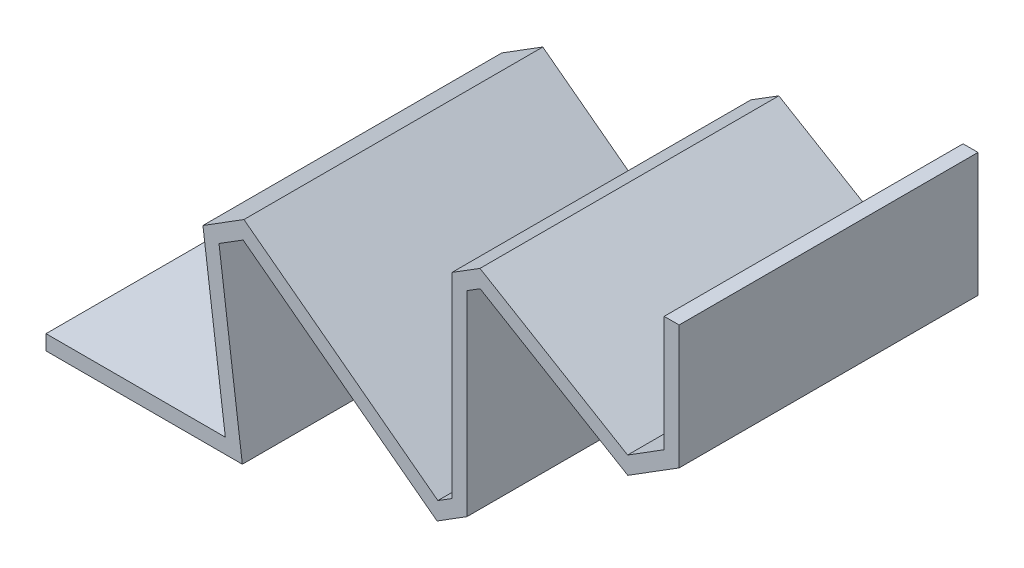
ISO-10303-21;
HEADER;
FILE_DESCRIPTION(('STEP AP214'),'2;1');
FILE_NAME('part.step','',(''),(''),'','','');
FILE_SCHEMA(('AUTOMOTIVE_DESIGN { 1 0 10303 214 1 1 1 1 }'));
ENDSEC;
DATA;
#1=APPLICATION_CONTEXT('core data for automotive mechanical design processes');
#2=APPLICATION_PROTOCOL_DEFINITION('international standard','automotive_design',2000,#1);
#3=PRODUCT_CONTEXT('',#1,'mechanical');
#4=PRODUCT('Part','Part','',(#3));
#5=PRODUCT_RELATED_PRODUCT_CATEGORY('part','',(#4));
#6=PRODUCT_DEFINITION_FORMATION('','',#4);
#7=PRODUCT_DEFINITION_CONTEXT('part definition',#1,'design');
#8=PRODUCT_DEFINITION('design','',#6,#7);
#9=PRODUCT_DEFINITION_SHAPE('','',#8);
#10=(LENGTH_UNIT() NAMED_UNIT(*) SI_UNIT(.MILLI.,.METRE.));
#11=(NAMED_UNIT(*) PLANE_ANGLE_UNIT() SI_UNIT($,.RADIAN.));
#12=(NAMED_UNIT(*) SI_UNIT($,.STERADIAN.) SOLID_ANGLE_UNIT());
#13=UNCERTAINTY_MEASURE_WITH_UNIT(LENGTH_MEASURE(1.E-05),#10,'distance_accuracy_value','');
#14=(GEOMETRIC_REPRESENTATION_CONTEXT(3) GLOBAL_UNCERTAINTY_ASSIGNED_CONTEXT((#13)) GLOBAL_UNIT_ASSIGNED_CONTEXT((#10,
#11,#12)) REPRESENTATION_CONTEXT('',''));
#15=CARTESIAN_POINT('',(0.,0.,0.));
#16=DIRECTION('',(0.,0.,1.));
#17=DIRECTION('',(1.,0.,0.));
#18=AXIS2_PLACEMENT_3D('',#15,#16,#17);
#19=CARTESIAN_POINT('',(3.28461007313167,0.,2.5));
#20=DIRECTION('',(0.,1.,0.));
#21=DIRECTION('',(-1.,0.,0.));
#22=AXIS2_PLACEMENT_3D('',#19,#20,#21);
#23=PLANE('',#22);
#24=DIRECTION('',(1.,0.,0.));
#25=VECTOR('',#24,1.);
#26=CARTESIAN_POINT('',(3.28461007313167,0.,-2.5));
#27=LINE('',#26,#25);
#28=CARTESIAN_POINT('',(0.,0.,-2.5));
#29=VERTEX_POINT('',#28);
#30=CARTESIAN_POINT('',(3.28461007313167,0.,-2.5));
#31=VERTEX_POINT('',#30);
#32=EDGE_CURVE('E134',#29,#31,#27,.T.);
#33=ORIENTED_EDGE('',*,*,#32,.T.);
#34=DIRECTION('',(0.,0.,-1.));
#35=VECTOR('',#34,1.);
#36=CARTESIAN_POINT('',(3.28461007313167,0.,2.5));
#37=LINE('',#36,#35);
#38=CARTESIAN_POINT('',(3.28461007313167,0.,2.5));
#39=VERTEX_POINT('',#38);
#40=EDGE_CURVE('E11',#39,#31,#37,.T.);
#41=ORIENTED_EDGE('',*,*,#40,.F.);
#42=DIRECTION('',(1.,0.,0.));
#43=VECTOR('',#42,1.);
#44=CARTESIAN_POINT('',(0.,0.,2.5));
#45=LINE('',#44,#43);
#46=CARTESIAN_POINT('',(0.,0.,2.5));
#47=VERTEX_POINT('',#46);
#48=EDGE_CURVE('E140',#47,#39,#45,.T.);
#49=ORIENTED_EDGE('',*,*,#48,.F.);
#50=DIRECTION('',(0.,0.,-1.));
#51=VECTOR('',#50,1.);
#52=CARTESIAN_POINT('',(0.,0.,2.5));
#53=LINE('',#52,#51);
#54=EDGE_CURVE('E220',#47,#29,#53,.T.);
#55=ORIENTED_EDGE('',*,*,#54,.T.);
#56=EDGE_LOOP('',(#33,#41,#49,#55));
#57=FACE_BOUND('',#56,.T.);
#58=ADVANCED_FACE('F39',(#57),#23,.F.);
#59=CARTESIAN_POINT('',(2.89412978055959,3.00316875454847,2.5));
#60=DIRECTION('',(-0.991652731655363,-0.128937425910623,0.));
#61=DIRECTION('',(0.128937425910623,-0.991652731655363,0.));
#62=AXIS2_PLACEMENT_3D('',#59,#60,#61);
#63=PLANE('',#62);
#64=DIRECTION('',(-0.128937425910623,0.991652731655362,0.));
#65=VECTOR('',#64,1.);
#66=CARTESIAN_POINT('',(2.89412978055959,3.00316875454847,-2.5));
#67=LINE('',#66,#65);
#68=CARTESIAN_POINT('',(2.89412978055959,3.00316875454847,-2.5));
#69=VERTEX_POINT('',#68);
#70=EDGE_CURVE('E226',#31,#69,#67,.T.);
#71=ORIENTED_EDGE('',*,*,#70,.T.);
#72=DIRECTION('',(0.,0.,-1.));
#73=VECTOR('',#72,1.);
#74=CARTESIAN_POINT('',(2.89412978055959,3.00316875454847,2.5));
#75=LINE('',#74,#73);
#76=CARTESIAN_POINT('',(2.89412978055959,3.00316875454847,2.5));
#77=VERTEX_POINT('',#76);
#78=EDGE_CURVE('E48',#77,#69,#75,.T.);
#79=ORIENTED_EDGE('',*,*,#78,.F.);
#80=DIRECTION('',(-0.128937425910623,0.991652731655362,0.));
#81=VECTOR('',#80,1.);
#82=CARTESIAN_POINT('',(2.89412978055959,3.00316875454847,2.5));
#83=LINE('',#82,#81);
#84=EDGE_CURVE('E442',#39,#77,#83,.T.);
#85=ORIENTED_EDGE('',*,*,#84,.F.);
#86=ORIENTED_EDGE('',*,*,#40,.T.);
#87=EDGE_LOOP('',(#71,#79,#85,#86));
#88=FACE_BOUND('',#87,.T.);
#89=ADVANCED_FACE('F447',(#88),#63,.F.);
#90=CARTESIAN_POINT('',(3.29779881563138,3.25541773696787,2.5));
#91=DIRECTION('',(-0.529932218646367,0.848040001203091,0.));
#92=DIRECTION('',(-0.848040001203091,-0.529932218646367,0.));
#93=AXIS2_PLACEMENT_3D('',#90,#91,#92);
#94=PLANE('',#93);
#95=DIRECTION('',(0.848040001203091,0.529932218646367,0.));
#96=VECTOR('',#95,1.);
#97=CARTESIAN_POINT('',(3.29779881563138,3.25541773696787,-2.5));
#98=LINE('',#97,#96);
#99=CARTESIAN_POINT('',(3.29779881563138,3.25541773696787,-2.5));
#100=VERTEX_POINT('',#99);
#101=EDGE_CURVE('E229',#69,#100,#98,.T.);
#102=ORIENTED_EDGE('',*,*,#101,.T.);
#103=DIRECTION('',(0.,0.,-1.));
#104=VECTOR('',#103,1.);
#105=CARTESIAN_POINT('',(3.29779881563138,3.25541773696787,2.5));
#106=LINE('',#105,#104);
#107=CARTESIAN_POINT('',(3.29779881563138,3.25541773696787,2.5));
#108=VERTEX_POINT('',#107);
#109=EDGE_CURVE('E354',#108,#100,#106,.T.);
#110=ORIENTED_EDGE('',*,*,#109,.F.);
#111=DIRECTION('',(0.848040001203091,0.529932218646367,0.));
#112=VECTOR('',#111,1.);
#113=CARTESIAN_POINT('',(3.29779881563138,3.25541773696787,2.5));
#114=LINE('',#113,#112);
#115=EDGE_CURVE('E365',#77,#108,#114,.T.);
#116=ORIENTED_EDGE('',*,*,#115,.F.);
#117=ORIENTED_EDGE('',*,*,#78,.T.);
#118=EDGE_LOOP('',(#102,#110,#116,#117));
#119=FACE_BOUND('',#118,.T.);
#120=ADVANCED_FACE('F363',(#119),#94,.F.);
#121=CARTESIAN_POINT('',(6.54225209286056,0.806747464691319,2.5));
#122=DIRECTION('',(0.602411026461014,0.798186040468128,0.));
#123=DIRECTION('',(-0.798186040468128,0.602411026461013,0.));
#124=AXIS2_PLACEMENT_3D('',#121,#122,#123);
#125=PLANE('',#124);
#126=DIRECTION('',(0.798186040468128,-0.602411026461014,0.));
#127=VECTOR('',#126,1.);
#128=CARTESIAN_POINT('',(6.54225209286056,0.806747464691319,-2.5));
#129=LINE('',#128,#127);
#130=CARTESIAN_POINT('',(6.54225209286056,0.806747464691319,-2.5));
#131=VERTEX_POINT('',#130);
#132=EDGE_CURVE('E232',#100,#131,#129,.T.);
#133=ORIENTED_EDGE('',*,*,#132,.T.);
#134=DIRECTION('',(0.,0.,-1.));
#135=VECTOR('',#134,1.);
#136=CARTESIAN_POINT('',(6.54225209286056,0.806747464691319,2.5));
#137=LINE('',#136,#135);
#138=CARTESIAN_POINT('',(6.54225209286056,0.806747464691319,2.5));
#139=VERTEX_POINT('',#138);
#140=EDGE_CURVE('E350',#139,#131,#137,.T.);
#141=ORIENTED_EDGE('',*,*,#140,.F.);
#142=DIRECTION('',(0.798186040468128,-0.602411026461014,0.));
#143=VECTOR('',#142,1.);
#144=CARTESIAN_POINT('',(6.54225209286056,0.806747464691319,2.5));
#145=LINE('',#144,#143);
#146=EDGE_CURVE('E384',#108,#139,#145,.T.);
#147=ORIENTED_EDGE('',*,*,#146,.F.);
#148=ORIENTED_EDGE('',*,*,#109,.T.);
#149=EDGE_LOOP('',(#133,#141,#147,#148));
#150=FACE_BOUND('',#149,.T.);
#151=ADVANCED_FACE('F374',(#150),#125,.F.);
#152=CARTESIAN_POINT('',(7.04216647309153,1.11913925785342,2.5));
#153=DIRECTION('',(-0.529932218646366,0.848040001203092,0.));
#154=DIRECTION('',(-0.848040001203092,-0.529932218646366,0.));
#155=AXIS2_PLACEMENT_3D('',#152,#153,#154);
#156=PLANE('',#155);
#157=DIRECTION('',(0.848040001203092,0.529932218646366,0.));
#158=VECTOR('',#157,1.);
#159=CARTESIAN_POINT('',(7.04216647309153,1.11913925785342,-2.5));
#160=LINE('',#159,#158);
#161=CARTESIAN_POINT('',(7.04216647309153,1.11913925785342,-2.5));
#162=VERTEX_POINT('',#161);
#163=EDGE_CURVE('E235',#131,#162,#160,.T.);
#164=ORIENTED_EDGE('',*,*,#163,.T.);
#165=DIRECTION('',(0.,0.,-1.));
#166=VECTOR('',#165,1.);
#167=CARTESIAN_POINT('',(7.04216647309153,1.11913925785342,2.5));
#168=LINE('',#167,#166);
#169=CARTESIAN_POINT('',(7.04216647309153,1.11913925785342,2.5));
#170=VERTEX_POINT('',#169);
#171=EDGE_CURVE('E346',#170,#162,#168,.T.);
#172=ORIENTED_EDGE('',*,*,#171,.F.);
#173=DIRECTION('',(0.848040001203092,0.529932218646366,0.));
#174=VECTOR('',#173,1.);
#175=CARTESIAN_POINT('',(7.04216647309153,1.11913925785342,2.5));
#176=LINE('',#175,#174);
#177=EDGE_CURVE('E380',#139,#170,#176,.T.);
#178=ORIENTED_EDGE('',*,*,#177,.F.);
#179=ORIENTED_EDGE('',*,*,#140,.T.);
#180=EDGE_LOOP('',(#164,#172,#178,#179));
#181=FACE_BOUND('',#180,.T.);
#182=ADVANCED_FACE('F378',(#181),#156,.F.);
#183=CARTESIAN_POINT('',(7.04216647309153,4.39465347848046,2.5));
#184=DIRECTION('',(-1.,0.,0.));
#185=DIRECTION('',(0.,0.,1.));
#186=AXIS2_PLACEMENT_3D('',#183,#184,#185);
#187=PLANE('',#186);
#188=DIRECTION('',(0.,1.,0.));
#189=VECTOR('',#188,1.);
#190=CARTESIAN_POINT('',(7.04216647309153,4.39465347848046,-2.5));
#191=LINE('',#190,#189);
#192=CARTESIAN_POINT('',(7.04216647309153,4.39465347848046,-2.5));
#193=VERTEX_POINT('',#192);
#194=EDGE_CURVE('E238',#162,#193,#191,.T.);
#195=ORIENTED_EDGE('',*,*,#194,.T.);
#196=DIRECTION('',(0.,0.,-1.));
#197=VECTOR('',#196,1.);
#198=CARTESIAN_POINT('',(7.04216647309153,4.39465347848046,2.5));
#199=LINE('',#198,#197);
#200=CARTESIAN_POINT('',(7.04216647309153,4.39465347848046,2.5));
#201=VERTEX_POINT('',#200);
#202=EDGE_CURVE('E342',#201,#193,#199,.T.);
#203=ORIENTED_EDGE('',*,*,#202,.F.);
#204=DIRECTION('',(0.,1.,0.));
#205=VECTOR('',#204,1.);
#206=CARTESIAN_POINT('',(7.04216647309153,4.39465347848046,2.5));
#207=LINE('',#206,#205);
#208=EDGE_CURVE('E383',#170,#201,#207,.T.);
#209=ORIENTED_EDGE('',*,*,#208,.F.);
#210=ORIENTED_EDGE('',*,*,#171,.T.);
#211=EDGE_LOOP('',(#195,#203,#209,#210));
#212=FACE_BOUND('',#211,.T.);
#213=ADVANCED_FACE('F459',(#212),#187,.F.);
#214=CARTESIAN_POINT('',(7.26296632864944,4.53262923099992,2.5));
#215=DIRECTION('',(-0.529932218646367,0.848040001203092,0.));
#216=DIRECTION('',(-0.848040001203092,-0.529932218646367,0.));
#217=AXIS2_PLACEMENT_3D('',#214,#215,#216);
#218=PLANE('',#217);
#219=DIRECTION('',(0.848040001203092,0.529932218646367,0.));
#220=VECTOR('',#219,1.);
#221=CARTESIAN_POINT('',(7.26296632864944,4.53262923099992,-2.5));
#222=LINE('',#221,#220);
#223=CARTESIAN_POINT('',(7.26296632864944,4.53262923099992,-2.5));
#224=VERTEX_POINT('',#223);
#225=EDGE_CURVE('E241',#193,#224,#222,.T.);
#226=ORIENTED_EDGE('',*,*,#225,.T.);
#227=DIRECTION('',(0.,0.,-1.));
#228=VECTOR('',#227,1.);
#229=CARTESIAN_POINT('',(7.26296632864944,4.53262923099992,2.5));
#230=LINE('',#229,#228);
#231=CARTESIAN_POINT('',(7.26296632864944,4.53262923099992,2.5));
#232=VERTEX_POINT('',#231);
#233=EDGE_CURVE('E338',#232,#224,#230,.T.);
#234=ORIENTED_EDGE('',*,*,#233,.F.);
#235=DIRECTION('',(0.848040001203092,0.529932218646367,0.));
#236=VECTOR('',#235,1.);
#237=CARTESIAN_POINT('',(7.26296632864944,4.53262923099992,2.5));
#238=LINE('',#237,#236);
#239=EDGE_CURVE('E388',#201,#232,#238,.T.);
#240=ORIENTED_EDGE('',*,*,#239,.F.);
#241=ORIENTED_EDGE('',*,*,#202,.T.);
#242=EDGE_LOOP('',(#226,#234,#240,#241));
#243=FACE_BOUND('',#242,.T.);
#244=ADVANCED_FACE('F462',(#243),#218,.F.);
#245=CARTESIAN_POINT('',(9.73273143623859,3.06352302945806,2.5));
#246=DIRECTION('',(0.511228925458816,0.85944457981549,0.));
#247=DIRECTION('',(-0.85944457981549,0.511228925458816,0.));
#248=AXIS2_PLACEMENT_3D('',#245,#246,#247);
#249=PLANE('',#248);
#250=DIRECTION('',(0.85944457981549,-0.511228925458816,0.));
#251=VECTOR('',#250,1.);
#252=CARTESIAN_POINT('',(9.73273143623859,3.06352302945806,-2.5));
#253=LINE('',#252,#251);
#254=CARTESIAN_POINT('',(9.73273143623859,3.06352302945806,-2.5));
#255=VERTEX_POINT('',#254);
#256=EDGE_CURVE('E244',#224,#255,#253,.T.);
#257=ORIENTED_EDGE('',*,*,#256,.T.);
#258=DIRECTION('',(0.,0.,-1.));
#259=VECTOR('',#258,1.);
#260=CARTESIAN_POINT('',(9.73273143623859,3.06352302945806,2.5));
#261=LINE('',#260,#259);
#262=CARTESIAN_POINT('',(9.73273143623859,3.06352302945806,2.5));
#263=VERTEX_POINT('',#262);
#264=EDGE_CURVE('E334',#263,#255,#261,.T.);
#265=ORIENTED_EDGE('',*,*,#264,.F.);
#266=DIRECTION('',(0.85944457981549,-0.511228925458816,0.));
#267=VECTOR('',#266,1.);
#268=CARTESIAN_POINT('',(9.73273143623859,3.06352302945806,2.5));
#269=LINE('',#268,#267);
#270=EDGE_CURVE('E395',#232,#263,#269,.T.);
#271=ORIENTED_EDGE('',*,*,#270,.F.);
#272=ORIENTED_EDGE('',*,*,#233,.T.);
#273=EDGE_LOOP('',(#257,#265,#271,#272));
#274=FACE_BOUND('',#273,.T.);
#275=ADVANCED_FACE('F466',(#274),#249,.F.);
#276=CARTESIAN_POINT('',(10.5916206589193,3.60023482453957,2.5));
#277=DIRECTION('',(-0.529932218646366,0.848040001203092,0.));
#278=DIRECTION('',(-0.848040001203092,-0.529932218646366,0.));
#279=AXIS2_PLACEMENT_3D('',#276,#277,#278);
#280=PLANE('',#279);
#281=DIRECTION('',(0.848040001203092,0.529932218646366,0.));
#282=VECTOR('',#281,1.);
#283=CARTESIAN_POINT('',(10.5916206589193,3.60023482453957,-2.5));
#284=LINE('',#283,#282);
#285=CARTESIAN_POINT('',(10.5916206589193,3.60023482453957,-2.5));
#286=VERTEX_POINT('',#285);
#287=EDGE_CURVE('E247',#255,#286,#284,.T.);
#288=ORIENTED_EDGE('',*,*,#287,.T.);
#289=DIRECTION('',(0.,0.,-1.));
#290=VECTOR('',#289,1.);
#291=CARTESIAN_POINT('',(10.5916206589193,3.60023482453957,2.5));
#292=LINE('',#291,#290);
#293=CARTESIAN_POINT('',(10.5916206589193,3.60023482453957,2.5));
#294=VERTEX_POINT('',#293);
#295=EDGE_CURVE('E330',#294,#286,#292,.T.);
#296=ORIENTED_EDGE('',*,*,#295,.F.);
#297=DIRECTION('',(0.848040001203092,0.529932218646366,0.));
#298=VECTOR('',#297,1.);
#299=CARTESIAN_POINT('',(10.5916206589193,3.60023482453957,2.5));
#300=LINE('',#299,#298);
#301=EDGE_CURVE('E398',#263,#294,#300,.T.);
#302=ORIENTED_EDGE('',*,*,#301,.F.);
#303=ORIENTED_EDGE('',*,*,#264,.T.);
#304=EDGE_LOOP('',(#288,#296,#302,#303));
#305=FACE_BOUND('',#304,.T.);
#306=ADVANCED_FACE('F470',(#305),#280,.F.);
#307=CARTESIAN_POINT('',(10.5916206589193,5.67150867052154,2.5));
#308=DIRECTION('',(-1.,0.,0.));
#309=DIRECTION('',(0.,0.,1.));
#310=AXIS2_PLACEMENT_3D('',#307,#308,#309);
#311=PLANE('',#310);
#312=DIRECTION('',(0.,1.,0.));
#313=VECTOR('',#312,1.);
#314=CARTESIAN_POINT('',(10.5916206589193,5.67150867052154,-2.5));
#315=LINE('',#314,#313);
#316=CARTESIAN_POINT('',(10.5916206589193,5.67150867052154,-2.5));
#317=VERTEX_POINT('',#316);
#318=EDGE_CURVE('E250',#286,#317,#315,.T.);
#319=ORIENTED_EDGE('',*,*,#318,.T.);
#320=DIRECTION('',(0.,0.,-1.));
#321=VECTOR('',#320,1.);
#322=CARTESIAN_POINT('',(10.5916206589193,5.67150867052154,2.5));
#323=LINE('',#322,#321);
#324=CARTESIAN_POINT('',(10.5916206589193,5.67150867052154,2.5));
#325=VERTEX_POINT('',#324);
#326=EDGE_CURVE('E326',#325,#317,#323,.T.);
#327=ORIENTED_EDGE('',*,*,#326,.F.);
#328=DIRECTION('',(0.,1.,0.));
#329=VECTOR('',#328,1.);
#330=CARTESIAN_POINT('',(10.5916206589193,5.67150867052154,2.5));
#331=LINE('',#330,#329);
#332=EDGE_CURVE('E401',#294,#325,#331,.T.);
#333=ORIENTED_EDGE('',*,*,#332,.F.);
#334=ORIENTED_EDGE('',*,*,#295,.T.);
#335=EDGE_LOOP('',(#319,#327,#333,#334));
#336=FACE_BOUND('',#335,.T.);
#337=ADVANCED_FACE('F474',(#336),#311,.F.);
#338=CARTESIAN_POINT('',(10.3416206589193,5.67150867052154,2.5));
#339=DIRECTION('',(0.,-1.,0.));
#340=DIRECTION('',(0.,0.,-1.));
#341=AXIS2_PLACEMENT_3D('',#338,#339,#340);
#342=PLANE('',#341);
#343=DIRECTION('',(-1.,0.,0.));
#344=VECTOR('',#343,1.);
#345=CARTESIAN_POINT('',(10.3416206589193,5.67150867052154,-2.5));
#346=LINE('',#345,#344);
#347=CARTESIAN_POINT('',(10.3416206589193,5.67150867052154,-2.5));
#348=VERTEX_POINT('',#347);
#349=EDGE_CURVE('E253',#317,#348,#346,.T.);
#350=ORIENTED_EDGE('',*,*,#349,.T.);
#351=DIRECTION('',(0.,0.,-1.));
#352=VECTOR('',#351,1.);
#353=CARTESIAN_POINT('',(10.3416206589193,5.67150867052154,2.5));
#354=LINE('',#353,#352);
#355=CARTESIAN_POINT('',(10.3416206589193,5.67150867052154,2.5));
#356=VERTEX_POINT('',#355);
#357=EDGE_CURVE('E322',#356,#348,#354,.T.);
#358=ORIENTED_EDGE('',*,*,#357,.F.);
#359=DIRECTION('',(-1.,0.,0.));
#360=VECTOR('',#359,1.);
#361=CARTESIAN_POINT('',(10.3416206589193,5.67150867052154,2.5));
#362=LINE('',#361,#360);
#363=EDGE_CURVE('E404',#325,#356,#362,.T.);
#364=ORIENTED_EDGE('',*,*,#363,.F.);
#365=ORIENTED_EDGE('',*,*,#326,.T.);
#366=EDGE_LOOP('',(#350,#358,#364,#365));
#367=FACE_BOUND('',#366,.T.);
#368=ADVANCED_FACE('F478',(#367),#342,.F.);
#369=CARTESIAN_POINT('',(10.3416206589193,3.73880959126247,2.5));
#370=DIRECTION('',(1.,0.,0.));
#371=DIRECTION('',(0.,0.,-1.));
#372=AXIS2_PLACEMENT_3D('',#369,#370,#371);
#373=PLANE('',#372);
#374=DIRECTION('',(0.,-1.,0.));
#375=VECTOR('',#374,1.);
#376=CARTESIAN_POINT('',(10.3416206589193,3.73880959126247,-2.5));
#377=LINE('',#376,#375);
#378=CARTESIAN_POINT('',(10.3416206589193,3.73880959126247,-2.5));
#379=VERTEX_POINT('',#378);
#380=EDGE_CURVE('E256',#348,#379,#377,.T.);
#381=ORIENTED_EDGE('',*,*,#380,.T.);
#382=DIRECTION('',(0.,0.,-1.));
#383=VECTOR('',#382,1.);
#384=CARTESIAN_POINT('',(10.3416206589193,3.73880959126247,2.5));
#385=LINE('',#384,#383);
#386=CARTESIAN_POINT('',(10.3416206589193,3.73880959126247,2.5));
#387=VERTEX_POINT('',#386);
#388=EDGE_CURVE('E318',#387,#379,#385,.T.);
#389=ORIENTED_EDGE('',*,*,#388,.F.);
#390=DIRECTION('',(0.,-1.,0.));
#391=VECTOR('',#390,1.);
#392=CARTESIAN_POINT('',(10.3416206589193,3.73880959126247,2.5));
#393=LINE('',#392,#391);
#394=EDGE_CURVE('E407',#356,#387,#393,.T.);
#395=ORIENTED_EDGE('',*,*,#394,.F.);
#396=ORIENTED_EDGE('',*,*,#357,.T.);
#397=EDGE_LOOP('',(#381,#389,#395,#396));
#398=FACE_BOUND('',#397,.T.);
#399=ADVANCED_FACE('F482',(#398),#373,.F.);
#400=CARTESIAN_POINT('',(9.72952426314497,3.35631631196202,2.5));
#401=DIRECTION('',(0.529932218646367,-0.848040001203091,0.));
#402=DIRECTION('',(0.848040001203091,0.529932218646367,0.));
#403=AXIS2_PLACEMENT_3D('',#400,#401,#402);
#404=PLANE('',#403);
#405=DIRECTION('',(-0.848040001203091,-0.529932218646367,0.));
#406=VECTOR('',#405,1.);
#407=CARTESIAN_POINT('',(9.72952426314497,3.35631631196202,-2.5));
#408=LINE('',#407,#406);
#409=CARTESIAN_POINT('',(9.72952426314497,3.35631631196202,-2.5));
#410=VERTEX_POINT('',#409);
#411=EDGE_CURVE('E259',#379,#410,#408,.T.);
#412=ORIENTED_EDGE('',*,*,#411,.T.);
#413=DIRECTION('',(0.,0.,-1.));
#414=VECTOR('',#413,1.);
#415=CARTESIAN_POINT('',(9.72952426314497,3.35631631196202,2.5));
#416=LINE('',#415,#414);
#417=CARTESIAN_POINT('',(9.72952426314497,3.35631631196202,2.5));
#418=VERTEX_POINT('',#417);
#419=EDGE_CURVE('E314',#418,#410,#416,.T.);
#420=ORIENTED_EDGE('',*,*,#419,.F.);
#421=DIRECTION('',(-0.848040001203091,-0.529932218646367,0.));
#422=VECTOR('',#421,1.);
#423=CARTESIAN_POINT('',(9.72952426314497,3.35631631196202,2.5));
#424=LINE('',#423,#422);
#425=EDGE_CURVE('E410',#387,#418,#424,.T.);
#426=ORIENTED_EDGE('',*,*,#425,.F.);
#427=ORIENTED_EDGE('',*,*,#388,.T.);
#428=EDGE_LOOP('',(#412,#420,#426,#427));
#429=FACE_BOUND('',#428,.T.);
#430=ADVANCED_FACE('F486',(#429),#404,.F.);
#431=CARTESIAN_POINT('',(7.25975915555582,4.82542251350388,2.5));
#432=DIRECTION('',(-0.511228925458816,-0.85944457981549,0.));
#433=DIRECTION('',(0.85944457981549,-0.511228925458816,0.));
#434=AXIS2_PLACEMENT_3D('',#431,#432,#433);
#435=PLANE('',#434);
#436=DIRECTION('',(-0.85944457981549,0.511228925458816,0.));
#437=VECTOR('',#436,1.);
#438=CARTESIAN_POINT('',(7.25975915555582,4.82542251350388,-2.5));
#439=LINE('',#438,#437);
#440=CARTESIAN_POINT('',(7.25975915555582,4.82542251350388,-2.5));
#441=VERTEX_POINT('',#440);
#442=EDGE_CURVE('E262',#410,#441,#439,.T.);
#443=ORIENTED_EDGE('',*,*,#442,.T.);
#444=DIRECTION('',(0.,0.,-1.));
#445=VECTOR('',#444,1.);
#446=CARTESIAN_POINT('',(7.25975915555582,4.82542251350388,2.5));
#447=LINE('',#446,#445);
#448=CARTESIAN_POINT('',(7.25975915555582,4.82542251350388,2.5));
#449=VERTEX_POINT('',#448);
#450=EDGE_CURVE('E310',#449,#441,#447,.T.);
#451=ORIENTED_EDGE('',*,*,#450,.F.);
#452=DIRECTION('',(-0.85944457981549,0.511228925458816,0.));
#453=VECTOR('',#452,1.);
#454=CARTESIAN_POINT('',(7.25975915555582,4.82542251350388,2.5));
#455=LINE('',#454,#453);
#456=EDGE_CURVE('E413',#418,#449,#455,.T.);
#457=ORIENTED_EDGE('',*,*,#456,.F.);
#458=ORIENTED_EDGE('',*,*,#419,.T.);
#459=EDGE_LOOP('',(#443,#451,#457,#458));
#460=FACE_BOUND('',#459,.T.);
#461=ADVANCED_FACE('F490',(#460),#435,.F.);
#462=CARTESIAN_POINT('',(6.79216647309153,4.53322824520336,2.5));
#463=DIRECTION('',(0.529932218646365,-0.848040001203092,0.));
#464=DIRECTION('',(0.848040001203092,0.529932218646365,0.));
#465=AXIS2_PLACEMENT_3D('',#462,#463,#464);
#466=PLANE('',#465);
#467=DIRECTION('',(-0.848040001203092,-0.529932218646365,0.));
#468=VECTOR('',#467,1.);
#469=CARTESIAN_POINT('',(6.79216647309153,4.53322824520336,-2.5));
#470=LINE('',#469,#468);
#471=CARTESIAN_POINT('',(6.79216647309153,4.53322824520336,-2.5));
#472=VERTEX_POINT('',#471);
#473=EDGE_CURVE('E265',#441,#472,#470,.T.);
#474=ORIENTED_EDGE('',*,*,#473,.T.);
#475=DIRECTION('',(0.,0.,-1.));
#476=VECTOR('',#475,1.);
#477=CARTESIAN_POINT('',(6.79216647309153,4.53322824520336,2.5));
#478=LINE('',#477,#476);
#479=CARTESIAN_POINT('',(6.79216647309153,4.53322824520336,2.5));
#480=VERTEX_POINT('',#479);
#481=EDGE_CURVE('E306',#480,#472,#478,.T.);
#482=ORIENTED_EDGE('',*,*,#481,.F.);
#483=DIRECTION('',(-0.848040001203092,-0.529932218646365,0.));
#484=VECTOR('',#483,1.);
#485=CARTESIAN_POINT('',(6.79216647309153,4.53322824520336,2.5));
#486=LINE('',#485,#484);
#487=EDGE_CURVE('E416',#449,#480,#486,.T.);
#488=ORIENTED_EDGE('',*,*,#487,.F.);
#489=ORIENTED_EDGE('',*,*,#450,.T.);
#490=EDGE_LOOP('',(#474,#482,#488,#489));
#491=FACE_BOUND('',#490,.T.);
#492=ADVANCED_FACE('F494',(#491),#466,.F.);
#493=CARTESIAN_POINT('',(6.79216647309153,1.25771402457632,2.5));
#494=DIRECTION('',(1.,0.,0.));
#495=DIRECTION('',(0.,1.,0.));
#496=AXIS2_PLACEMENT_3D('',#493,#494,#495);
#497=PLANE('',#496);
#498=DIRECTION('',(0.,-1.,0.));
#499=VECTOR('',#498,1.);
#500=CARTESIAN_POINT('',(6.79216647309153,1.25771402457632,-2.5));
#501=LINE('',#500,#499);
#502=CARTESIAN_POINT('',(6.79216647309153,1.25771402457632,-2.5));
#503=VERTEX_POINT('',#502);
#504=EDGE_CURVE('E268',#472,#503,#501,.T.);
#505=ORIENTED_EDGE('',*,*,#504,.T.);
#506=DIRECTION('',(0.,0.,-1.));
#507=VECTOR('',#506,1.);
#508=CARTESIAN_POINT('',(6.79216647309153,1.25771402457632,2.5));
#509=LINE('',#508,#507);
#510=CARTESIAN_POINT('',(6.79216647309153,1.25771402457632,2.5));
#511=VERTEX_POINT('',#510);
#512=EDGE_CURVE('E302',#511,#503,#509,.T.);
#513=ORIENTED_EDGE('',*,*,#512,.F.);
#514=DIRECTION('',(0.,-1.,0.));
#515=VECTOR('',#514,1.);
#516=CARTESIAN_POINT('',(6.79216647309153,1.25771402457632,2.5));
#517=LINE('',#516,#515);
#518=EDGE_CURVE('E419',#480,#511,#517,.T.);
#519=ORIENTED_EDGE('',*,*,#518,.F.);
#520=ORIENTED_EDGE('',*,*,#481,.T.);
#521=EDGE_LOOP('',(#505,#513,#519,#520));
#522=FACE_BOUND('',#521,.T.);
#523=ADVANCED_FACE('F498',(#522),#497,.F.);
#524=CARTESIAN_POINT('',(6.55559839920949,1.10988486076877,2.5));
#525=DIRECTION('',(0.529932218646366,-0.848040001203092,0.));
#526=DIRECTION('',(0.848040001203092,0.529932218646366,0.));
#527=AXIS2_PLACEMENT_3D('',#524,#525,#526);
#528=PLANE('',#527);
#529=DIRECTION('',(-0.848040001203092,-0.529932218646366,0.));
#530=VECTOR('',#529,1.);
#531=CARTESIAN_POINT('',(6.55559839920949,1.10988486076877,-2.5));
#532=LINE('',#531,#530);
#533=CARTESIAN_POINT('',(6.55559839920949,1.10988486076877,-2.5));
#534=VERTEX_POINT('',#533);
#535=EDGE_CURVE('E271',#503,#534,#532,.T.);
#536=ORIENTED_EDGE('',*,*,#535,.T.);
#537=DIRECTION('',(0.,0.,-1.));
#538=VECTOR('',#537,1.);
#539=CARTESIAN_POINT('',(6.55559839920949,1.10988486076877,2.5));
#540=LINE('',#539,#538);
#541=CARTESIAN_POINT('',(6.55559839920949,1.10988486076877,2.5));
#542=VERTEX_POINT('',#541);
#543=EDGE_CURVE('E298',#542,#534,#540,.T.);
#544=ORIENTED_EDGE('',*,*,#543,.F.);
#545=DIRECTION('',(-0.848040001203092,-0.529932218646366,0.));
#546=VECTOR('',#545,1.);
#547=CARTESIAN_POINT('',(6.55559839920949,1.10988486076877,2.5));
#548=LINE('',#547,#546);
#549=EDGE_CURVE('E422',#511,#542,#548,.T.);
#550=ORIENTED_EDGE('',*,*,#549,.F.);
#551=ORIENTED_EDGE('',*,*,#512,.T.);
#552=EDGE_LOOP('',(#536,#544,#550,#551));
#553=FACE_BOUND('',#552,.T.);
#554=ADVANCED_FACE('F502',(#553),#528,.F.);
#555=CARTESIAN_POINT('',(3.31114512198031,3.55855513304532,2.5));
#556=DIRECTION('',(-0.602411026461014,-0.798186040468128,0.));
#557=DIRECTION('',(0.798186040468128,-0.602411026461014,0.));
#558=AXIS2_PLACEMENT_3D('',#555,#556,#557);
#559=PLANE('',#558);
#560=DIRECTION('',(-0.798186040468128,0.602411026461014,0.));
#561=VECTOR('',#560,1.);
#562=CARTESIAN_POINT('',(3.31114512198031,3.55855513304532,-2.5));
#563=LINE('',#562,#561);
#564=CARTESIAN_POINT('',(3.31114512198031,3.55855513304532,-2.5));
#565=VERTEX_POINT('',#564);
#566=EDGE_CURVE('E274',#534,#565,#563,.T.);
#567=ORIENTED_EDGE('',*,*,#566,.T.);
#568=DIRECTION('',(0.,0.,-1.));
#569=VECTOR('',#568,1.);
#570=CARTESIAN_POINT('',(3.31114512198031,3.55855513304532,2.5));
#571=LINE('',#570,#569);
#572=CARTESIAN_POINT('',(3.31114512198031,3.55855513304532,2.5));
#573=VERTEX_POINT('',#572);
#574=EDGE_CURVE('E294',#573,#565,#571,.T.);
#575=ORIENTED_EDGE('',*,*,#574,.F.);
#576=DIRECTION('',(-0.798186040468128,0.602411026461014,0.));
#577=VECTOR('',#576,1.);
#578=CARTESIAN_POINT('',(3.31114512198031,3.55855513304532,2.5));
#579=LINE('',#578,#577);
#580=EDGE_CURVE('E425',#542,#573,#579,.T.);
#581=ORIENTED_EDGE('',*,*,#580,.F.);
#582=ORIENTED_EDGE('',*,*,#543,.T.);
#583=EDGE_LOOP('',(#567,#575,#581,#582));
#584=FACE_BOUND('',#583,.T.);
#585=ADVANCED_FACE('F433',(#584),#559,.F.);
#586=CARTESIAN_POINT('',(2.62551960097135,3.13011419512566,2.5));
#587=DIRECTION('',(0.529932218646367,-0.848040001203092,0.));
#588=DIRECTION('',(0.848040001203092,0.529932218646367,0.));
#589=AXIS2_PLACEMENT_3D('',#586,#587,#588);
#590=PLANE('',#589);
#591=DIRECTION('',(-0.848040001203092,-0.529932218646367,0.));
#592=VECTOR('',#591,1.);
#593=CARTESIAN_POINT('',(2.62551960097135,3.13011419512566,-2.5));
#594=LINE('',#593,#592);
#595=CARTESIAN_POINT('',(2.62551960097135,3.13011419512566,-2.5));
#596=VERTEX_POINT('',#595);
#597=EDGE_CURVE('E277',#565,#596,#594,.T.);
#598=ORIENTED_EDGE('',*,*,#597,.T.);
#599=DIRECTION('',(0.,0.,-1.));
#600=VECTOR('',#599,1.);
#601=CARTESIAN_POINT('',(2.62551960097135,3.13011419512566,2.5));
#602=LINE('',#601,#600);
#603=CARTESIAN_POINT('',(2.62551960097135,3.13011419512566,2.5));
#604=VERTEX_POINT('',#603);
#605=EDGE_CURVE('E213',#604,#596,#602,.T.);
#606=ORIENTED_EDGE('',*,*,#605,.F.);
#607=DIRECTION('',(-0.848040001203092,-0.529932218646367,0.));
#608=VECTOR('',#607,1.);
#609=CARTESIAN_POINT('',(2.62551960097135,3.13011419512566,2.5));
#610=LINE('',#609,#608);
#611=EDGE_CURVE('E202',#573,#604,#610,.T.);
#612=ORIENTED_EDGE('',*,*,#611,.F.);
#613=ORIENTED_EDGE('',*,*,#574,.T.);
#614=EDGE_LOOP('',(#598,#606,#612,#613));
#615=FACE_BOUND('',#614,.T.);
#616=ADVANCED_FACE('F437',(#615),#590,.F.);
#617=CARTESIAN_POINT('',(3.,0.25,2.5));
#618=DIRECTION('',(0.991652731655363,0.128937425910623,0.));
#619=DIRECTION('',(-0.128937425910623,0.991652731655363,0.));
#620=AXIS2_PLACEMENT_3D('',#617,#618,#619);
#621=PLANE('',#620);
#622=DIRECTION('',(0.128937425910623,-0.991652731655362,0.));
#623=VECTOR('',#622,1.);
#624=CARTESIAN_POINT('',(3.,0.25,-2.5));
#625=LINE('',#624,#623);
#626=CARTESIAN_POINT('',(3.,0.25,-2.5));
#627=VERTEX_POINT('',#626);
#628=EDGE_CURVE('E211',#596,#627,#625,.T.);
#629=ORIENTED_EDGE('',*,*,#628,.T.);
#630=DIRECTION('',(0.,0.,-1.));
#631=VECTOR('',#630,1.);
#632=CARTESIAN_POINT('',(3.,0.25,2.5));
#633=LINE('',#632,#631);
#634=CARTESIAN_POINT('',(3.,0.25,2.5));
#635=VERTEX_POINT('',#634);
#636=EDGE_CURVE('E208',#635,#627,#633,.T.);
#637=ORIENTED_EDGE('',*,*,#636,.F.);
#638=DIRECTION('',(0.128937425910623,-0.991652731655362,0.));
#639=VECTOR('',#638,1.);
#640=CARTESIAN_POINT('',(3.,0.25,2.5));
#641=LINE('',#640,#639);
#642=EDGE_CURVE('E196',#604,#635,#641,.T.);
#643=ORIENTED_EDGE('',*,*,#642,.F.);
#644=ORIENTED_EDGE('',*,*,#605,.T.);
#645=EDGE_LOOP('',(#629,#637,#643,#644));
#646=FACE_BOUND('',#645,.T.);
#647=ADVANCED_FACE('F209',(#646),#621,.F.);
#648=CARTESIAN_POINT('',(0.,0.25,2.5));
#649=DIRECTION('',(0.,-1.,0.));
#650=DIRECTION('',(0.,0.,-1.));
#651=AXIS2_PLACEMENT_3D('',#648,#649,#650);
#652=PLANE('',#651);
#653=DIRECTION('',(-1.,0.,0.));
#654=VECTOR('',#653,1.);
#655=CARTESIAN_POINT('',(0.,0.25,-2.5));
#656=LINE('',#655,#654);
#657=CARTESIAN_POINT('',(0.,0.25,-2.5));
#658=VERTEX_POINT('',#657);
#659=EDGE_CURVE('E127',#627,#658,#656,.T.);
#660=ORIENTED_EDGE('',*,*,#659,.T.);
#661=DIRECTION('',(0.,0.,-1.));
#662=VECTOR('',#661,1.);
#663=CARTESIAN_POINT('',(0.,0.25,2.5));
#664=LINE('',#663,#662);
#665=CARTESIAN_POINT('',(0.,0.25,2.5));
#666=VERTEX_POINT('',#665);
#667=EDGE_CURVE('E214',#666,#658,#664,.T.);
#668=ORIENTED_EDGE('',*,*,#667,.F.);
#669=DIRECTION('',(-1.,0.,0.));
#670=VECTOR('',#669,1.);
#671=CARTESIAN_POINT('',(0.,0.25,2.5));
#672=LINE('',#671,#670);
#673=EDGE_CURVE('E200',#635,#666,#672,.T.);
#674=ORIENTED_EDGE('',*,*,#673,.F.);
#675=ORIENTED_EDGE('',*,*,#636,.T.);
#676=EDGE_LOOP('',(#660,#668,#674,#675));
#677=FACE_BOUND('',#676,.T.);
#678=ADVANCED_FACE('F216',(#677),#652,.F.);
#679=CARTESIAN_POINT('',(0.,0.,2.5));
#680=DIRECTION('',(1.,0.,0.));
#681=DIRECTION('',(0.,0.,-1.));
#682=AXIS2_PLACEMENT_3D('',#679,#680,#681);
#683=PLANE('',#682);
#684=DIRECTION('',(0.,-1.,0.));
#685=VECTOR('',#684,1.);
#686=CARTESIAN_POINT('',(0.,0.,-2.5));
#687=LINE('',#686,#685);
#688=EDGE_CURVE('E284',#658,#29,#687,.T.);
#689=ORIENTED_EDGE('',*,*,#688,.T.);
#690=ORIENTED_EDGE('',*,*,#54,.F.);
#691=DIRECTION('',(0.,-1.,0.));
#692=VECTOR('',#691,1.);
#693=CARTESIAN_POINT('',(0.,0.,2.5));
#694=LINE('',#693,#692);
#695=EDGE_CURVE('E56',#666,#47,#694,.T.);
#696=ORIENTED_EDGE('',*,*,#695,.F.);
#697=ORIENTED_EDGE('',*,*,#667,.T.);
#698=EDGE_LOOP('',(#689,#690,#696,#697));
#699=FACE_BOUND('',#698,.T.);
#700=ADVANCED_FACE('F439',(#699),#683,.F.);
#701=CARTESIAN_POINT('',(0.,0.,2.5));
#702=DIRECTION('',(0.,0.,-1.));
#703=DIRECTION('',(-1.,0.,0.));
#704=AXIS2_PLACEMENT_3D('',#701,#702,#703);
#705=PLANE('',#704);
#706=ORIENTED_EDGE('',*,*,#48,.T.);
#707=ORIENTED_EDGE('',*,*,#84,.T.);
#708=ORIENTED_EDGE('',*,*,#115,.T.);
#709=ORIENTED_EDGE('',*,*,#146,.T.);
#710=ORIENTED_EDGE('',*,*,#177,.T.);
#711=ORIENTED_EDGE('',*,*,#208,.T.);
#712=ORIENTED_EDGE('',*,*,#239,.T.);
#713=ORIENTED_EDGE('',*,*,#270,.T.);
#714=ORIENTED_EDGE('',*,*,#301,.T.);
#715=ORIENTED_EDGE('',*,*,#332,.T.);
#716=ORIENTED_EDGE('',*,*,#363,.T.);
#717=ORIENTED_EDGE('',*,*,#394,.T.);
#718=ORIENTED_EDGE('',*,*,#425,.T.);
#719=ORIENTED_EDGE('',*,*,#456,.T.);
#720=ORIENTED_EDGE('',*,*,#487,.T.);
#721=ORIENTED_EDGE('',*,*,#518,.T.);
#722=ORIENTED_EDGE('',*,*,#549,.T.);
#723=ORIENTED_EDGE('',*,*,#580,.T.);
#724=ORIENTED_EDGE('',*,*,#611,.T.);
#725=ORIENTED_EDGE('',*,*,#642,.T.);
#726=ORIENTED_EDGE('',*,*,#673,.T.);
#727=ORIENTED_EDGE('',*,*,#695,.T.);
#728=EDGE_LOOP('',(#706,#707,#708,#709,#710,#711,#712,#713,#714,#715,#716,#717,#718,#719,#720,
#721,#722,#723,#724,#725,#726,#727));
#729=FACE_BOUND('',#728,.T.);
#730=ADVANCED_FACE('F198',(#729),#705,.F.);
#731=CARTESIAN_POINT('',(0.,0.,-2.5));
#732=DIRECTION('',(0.,0.,-1.));
#733=DIRECTION('',(-1.,0.,0.));
#734=AXIS2_PLACEMENT_3D('',#731,#732,#733);
#735=PLANE('',#734);
#736=ORIENTED_EDGE('',*,*,#32,.F.);
#737=ORIENTED_EDGE('',*,*,#688,.F.);
#738=ORIENTED_EDGE('',*,*,#659,.F.);
#739=ORIENTED_EDGE('',*,*,#628,.F.);
#740=ORIENTED_EDGE('',*,*,#597,.F.);
#741=ORIENTED_EDGE('',*,*,#566,.F.);
#742=ORIENTED_EDGE('',*,*,#535,.F.);
#743=ORIENTED_EDGE('',*,*,#504,.F.);
#744=ORIENTED_EDGE('',*,*,#473,.F.);
#745=ORIENTED_EDGE('',*,*,#442,.F.);
#746=ORIENTED_EDGE('',*,*,#411,.F.);
#747=ORIENTED_EDGE('',*,*,#380,.F.);
#748=ORIENTED_EDGE('',*,*,#349,.F.);
#749=ORIENTED_EDGE('',*,*,#318,.F.);
#750=ORIENTED_EDGE('',*,*,#287,.F.);
#751=ORIENTED_EDGE('',*,*,#256,.F.);
#752=ORIENTED_EDGE('',*,*,#225,.F.);
#753=ORIENTED_EDGE('',*,*,#194,.F.);
#754=ORIENTED_EDGE('',*,*,#163,.F.);
#755=ORIENTED_EDGE('',*,*,#132,.F.);
#756=ORIENTED_EDGE('',*,*,#101,.F.);
#757=ORIENTED_EDGE('',*,*,#70,.F.);
#758=EDGE_LOOP('',(#736,#737,#738,#739,#740,#741,#742,#743,#744,#745,#746,#747,#748,#749,#750,
#751,#752,#753,#754,#755,#756,#757));
#759=FACE_BOUND('',#758,.T.);
#760=ADVANCED_FACE('F369',(#759),#735,.T.);
#761=CLOSED_SHELL('',(#58,#89,#120,#151,#182,#213,#244,#275,#306,#337,#368,#399,#430,#461,#492,
#523,#554,#585,#616,#647,#678,#700,#730,#760));
#762=MANIFOLD_SOLID_BREP('B2',#761);
#763=ADVANCED_BREP_SHAPE_REPRESENTATION('',(#18,#762),#14);
#764=SHAPE_DEFINITION_REPRESENTATION(#9,#763);
ENDSEC;
END-ISO-10303-21;
